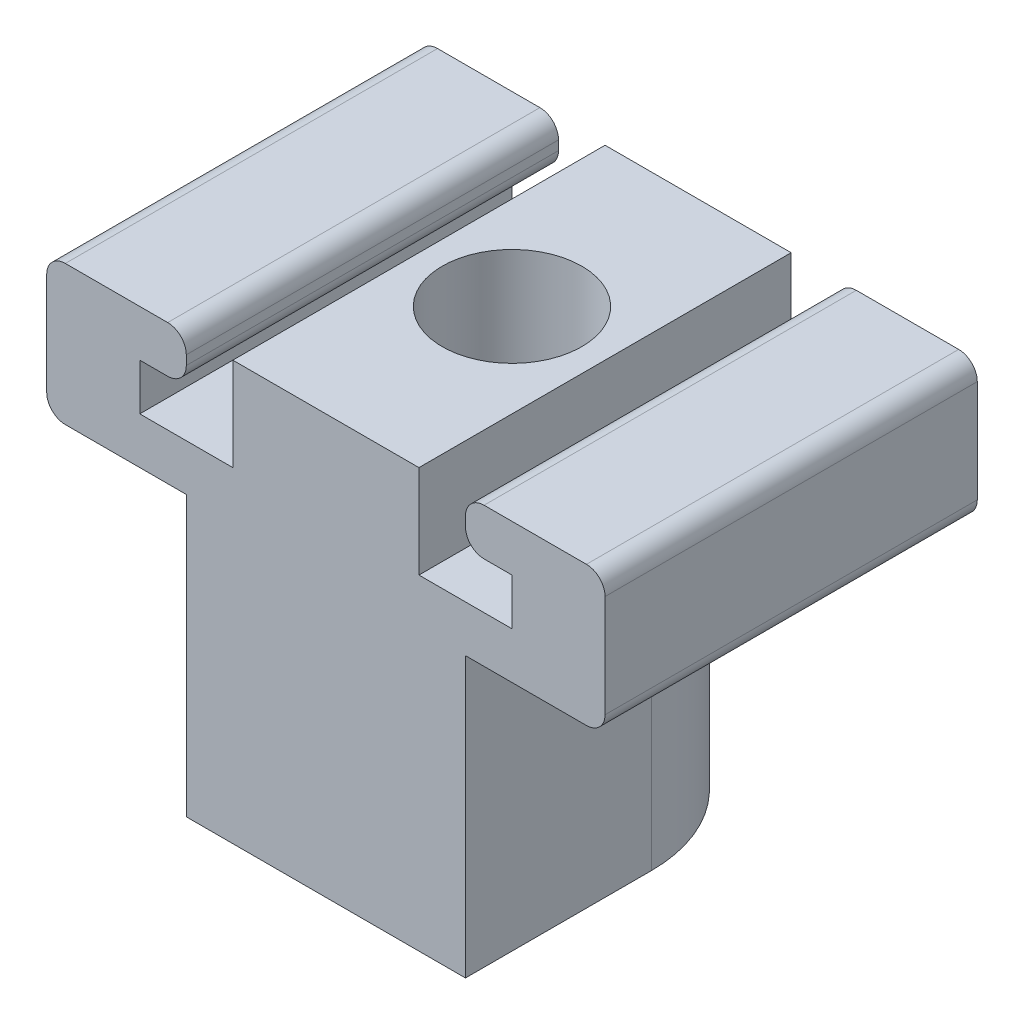
ISO-10303-21;
HEADER;
FILE_DESCRIPTION(('STEP AP214'),'2;1');
FILE_NAME('part.step','',(''),(''),'','','');
FILE_SCHEMA(('AUTOMOTIVE_DESIGN { 1 0 10303 214 1 1 1 1 }'));
ENDSEC;
DATA;
#1=APPLICATION_CONTEXT('core data for automotive mechanical design processes');
#2=APPLICATION_PROTOCOL_DEFINITION('international standard','automotive_design',2000,#1);
#3=PRODUCT_CONTEXT('',#1,'mechanical');
#4=PRODUCT('Part','Part','',(#3));
#5=PRODUCT_RELATED_PRODUCT_CATEGORY('part','',(#4));
#6=PRODUCT_DEFINITION_FORMATION('','',#4);
#7=PRODUCT_DEFINITION_CONTEXT('part definition',#1,'design');
#8=PRODUCT_DEFINITION('design','',#6,#7);
#9=PRODUCT_DEFINITION_SHAPE('','',#8);
#10=(LENGTH_UNIT() NAMED_UNIT(*) SI_UNIT(.MILLI.,.METRE.));
#11=(NAMED_UNIT(*) PLANE_ANGLE_UNIT() SI_UNIT($,.RADIAN.));
#12=(NAMED_UNIT(*) SI_UNIT($,.STERADIAN.) SOLID_ANGLE_UNIT());
#13=UNCERTAINTY_MEASURE_WITH_UNIT(LENGTH_MEASURE(1.E-05),#10,'distance_accuracy_value','');
#14=(GEOMETRIC_REPRESENTATION_CONTEXT(3) GLOBAL_UNCERTAINTY_ASSIGNED_CONTEXT((#13)) GLOBAL_UNIT_ASSIGNED_CONTEXT((#10,
#11,#12)) REPRESENTATION_CONTEXT('',''));
#15=CARTESIAN_POINT('',(0.,0.,0.));
#16=DIRECTION('',(0.,0.,1.));
#17=DIRECTION('',(1.,0.,0.));
#18=AXIS2_PLACEMENT_3D('',#15,#16,#17);
#19=CARTESIAN_POINT('',(0.,9.526,0.));
#20=DIRECTION('',(0.,-1.,0.));
#21=DIRECTION('',(0.,0.,-1.));
#22=AXIS2_PLACEMENT_3D('',#19,#20,#21);
#23=CYLINDRICAL_SURFACE('',#22,4.7625);
#24=CARTESIAN_POINT('',(0.,9.525,0.));
#25=DIRECTION('',(0.,-1.,0.));
#26=DIRECTION('',(0.,0.,-1.));
#27=AXIS2_PLACEMENT_3D('',#24,#25,#26);
#28=CIRCLE('',#27,4.7625);
#29=CARTESIAN_POINT('',(0.,9.525,-4.7625));
#30=VERTEX_POINT('',#29);
#31=EDGE_CURVE('E618',#30,#30,#28,.F.);
#32=ORIENTED_EDGE('',*,*,#31,.T.);
#33=EDGE_LOOP('',(#32));
#34=FACE_BOUND('',#33,.T.);
#35=CARTESIAN_POINT('',(0.,0.,0.));
#36=DIRECTION('',(0.,-1.,0.));
#37=DIRECTION('',(0.,0.,-1.));
#38=AXIS2_PLACEMENT_3D('',#35,#36,#37);
#39=CIRCLE('',#38,4.7625);
#40=CARTESIAN_POINT('',(0.,0.,-4.7625));
#41=VERTEX_POINT('',#40);
#42=EDGE_CURVE('E616',#41,#41,#39,.F.);
#43=ORIENTED_EDGE('',*,*,#42,.F.);
#44=EDGE_LOOP('',(#43));
#45=FACE_BOUND('',#44,.T.);
#46=ADVANCED_FACE('F33',(#34,#45),#23,.F.);
#47=CARTESIAN_POINT('',(0.,9.525,0.));
#48=DIRECTION('',(0.,-1.,0.));
#49=DIRECTION('',(0.,0.,-1.));
#50=AXIS2_PLACEMENT_3D('',#47,#48,#49);
#51=PLANE('',#50);
#52=DIRECTION('',(-1.,0.,0.));
#53=VECTOR('',#52,1.);
#54=CARTESIAN_POINT('',(-19.05,9.525,-12.7));
#55=LINE('',#54,#53);
#56=CARTESIAN_POINT('',(-10.795,9.525,-12.7));
#57=VERTEX_POINT('',#56);
#58=CARTESIAN_POINT('',(-17.78,9.525,-12.7));
#59=VERTEX_POINT('',#58);
#60=EDGE_CURVE('E326',#57,#59,#55,.T.);
#61=ORIENTED_EDGE('',*,*,#60,.T.);
#62=DIRECTION('',(0.,0.,1.));
#63=VECTOR('',#62,1.);
#64=CARTESIAN_POINT('',(-17.78,9.525,0.));
#65=LINE('',#64,#63);
#66=CARTESIAN_POINT('',(-17.78,9.525,12.7));
#67=VERTEX_POINT('',#66);
#68=EDGE_CURVE('E380',#59,#67,#65,.T.);
#69=ORIENTED_EDGE('',*,*,#68,.T.);
#70=DIRECTION('',(1.,0.,0.));
#71=VECTOR('',#70,1.);
#72=CARTESIAN_POINT('',(-19.05,9.525,12.7));
#73=LINE('',#72,#71);
#74=CARTESIAN_POINT('',(-10.795,9.525,12.7));
#75=VERTEX_POINT('',#74);
#76=EDGE_CURVE('E336',#67,#75,#73,.T.);
#77=ORIENTED_EDGE('',*,*,#76,.T.);
#78=DIRECTION('',(0.,0.,-1.));
#79=VECTOR('',#78,1.);
#80=CARTESIAN_POINT('',(-10.795,9.525,-12.7));
#81=LINE('',#80,#79);
#82=EDGE_CURVE('E377',#75,#57,#81,.T.);
#83=ORIENTED_EDGE('',*,*,#82,.T.);
#84=EDGE_LOOP('',(#61,#69,#77,#83));
#85=FACE_BOUND('',#84,.T.);
#86=ADVANCED_FACE('F509',(#85),#51,.F.);
#87=ORIENTED_EDGE('',*,*,#31,.F.);
#88=EDGE_LOOP('',(#87));
#89=FACE_BOUND('',#88,.T.);
#90=DIRECTION('',(0.,0.,-1.));
#91=VECTOR('',#90,1.);
#92=CARTESIAN_POINT('',(-6.35000000000002,9.525,12.701));
#93=LINE('',#92,#91);
#94=CARTESIAN_POINT('',(-6.35000000000002,9.525,12.7));
#95=VERTEX_POINT('',#94);
#96=CARTESIAN_POINT('',(-6.35000000000002,9.525,-12.7));
#97=VERTEX_POINT('',#96);
#98=EDGE_CURVE('E276',#95,#97,#93,.T.);
#99=ORIENTED_EDGE('',*,*,#98,.F.);
#100=CARTESIAN_POINT('',(6.35000000000002,9.525,12.7));
#101=VERTEX_POINT('',#100);
#102=EDGE_CURVE('E335',#95,#101,#73,.T.);
#103=ORIENTED_EDGE('',*,*,#102,.T.);
#104=DIRECTION('',(0.,0.,-1.));
#105=VECTOR('',#104,1.);
#106=CARTESIAN_POINT('',(6.35000000000002,9.525,12.701));
#107=LINE('',#106,#105);
#108=CARTESIAN_POINT('',(6.35000000000002,9.525,-12.7));
#109=VERTEX_POINT('',#108);
#110=EDGE_CURVE('E313',#101,#109,#107,.T.);
#111=ORIENTED_EDGE('',*,*,#110,.T.);
#112=EDGE_CURVE('E329',#109,#97,#55,.T.);
#113=ORIENTED_EDGE('',*,*,#112,.T.);
#114=EDGE_LOOP('',(#99,#103,#111,#113));
#115=FACE_BOUND('',#114,.T.);
#116=ADVANCED_FACE('F463',(#89,#115),#51,.F.);
#117=CARTESIAN_POINT('',(-19.05,9.525,-12.7));
#118=DIRECTION('',(0.,0.,1.));
#119=DIRECTION('',(1.,0.,0.));
#120=AXIS2_PLACEMENT_3D('',#117,#118,#119);
#121=PLANE('',#120);
#122=DIRECTION('',(0.,-1.,0.));
#123=VECTOR('',#122,1.);
#124=CARTESIAN_POINT('',(19.05,9.525,-12.7));
#125=LINE('',#124,#123);
#126=CARTESIAN_POINT('',(19.05,8.255,-12.7));
#127=VERTEX_POINT('',#126);
#128=CARTESIAN_POINT('',(19.05,1.27,-12.7));
#129=VERTEX_POINT('',#128);
#130=EDGE_CURVE('E435',#127,#129,#125,.T.);
#131=ORIENTED_EDGE('',*,*,#130,.T.);
#132=CARTESIAN_POINT('',(17.78,1.27,-12.7));
#133=DIRECTION('',(0.,0.,1.));
#134=DIRECTION('',(1.,0.,0.));
#135=AXIS2_PLACEMENT_3D('',#132,#133,#134);
#136=CIRCLE('',#135,1.27);
#137=CARTESIAN_POINT('',(17.78,0.,-12.7));
#138=VERTEX_POINT('',#137);
#139=EDGE_CURVE('E351',#129,#138,#136,.F.);
#140=ORIENTED_EDGE('',*,*,#139,.T.);
#141=DIRECTION('',(-1.,0.,0.));
#142=VECTOR('',#141,1.);
#143=CARTESIAN_POINT('',(-19.05,0.,-12.7));
#144=LINE('',#143,#142);
#145=CARTESIAN_POINT('',(-17.78,0.,-12.7));
#146=VERTEX_POINT('',#145);
#147=EDGE_CURVE('E325',#138,#146,#144,.T.);
#148=ORIENTED_EDGE('',*,*,#147,.T.);
#149=CARTESIAN_POINT('',(-17.78,1.27,-12.7));
#150=DIRECTION('',(0.,0.,1.));
#151=DIRECTION('',(1.,0.,0.));
#152=AXIS2_PLACEMENT_3D('',#149,#150,#151);
#153=CIRCLE('',#152,1.27);
#154=CARTESIAN_POINT('',(-19.05,1.27,-12.7));
#155=VERTEX_POINT('',#154);
#156=EDGE_CURVE('E429',#146,#155,#153,.F.);
#157=ORIENTED_EDGE('',*,*,#156,.T.);
#158=DIRECTION('',(0.,-1.,0.));
#159=VECTOR('',#158,1.);
#160=CARTESIAN_POINT('',(-19.05,9.525,-12.7));
#161=LINE('',#160,#159);
#162=CARTESIAN_POINT('',(-19.05,8.255,-12.7));
#163=VERTEX_POINT('',#162);
#164=EDGE_CURVE('E455',#163,#155,#161,.T.);
#165=ORIENTED_EDGE('',*,*,#164,.F.);
#166=CARTESIAN_POINT('',(-17.78,8.255,-12.7));
#167=DIRECTION('',(0.,0.,1.));
#168=DIRECTION('',(1.,0.,0.));
#169=AXIS2_PLACEMENT_3D('',#166,#167,#168);
#170=CIRCLE('',#169,1.27);
#171=EDGE_CURVE('E428',#163,#59,#170,.F.);
#172=ORIENTED_EDGE('',*,*,#171,.T.);
#173=ORIENTED_EDGE('',*,*,#60,.F.);
#174=CARTESIAN_POINT('',(-10.795,8.255,-12.7));
#175=DIRECTION('',(0.,0.,1.));
#176=DIRECTION('',(1.,0.,0.));
#177=AXIS2_PLACEMENT_3D('',#174,#175,#176);
#178=CIRCLE('',#177,1.27);
#179=CARTESIAN_POINT('',(-9.52500000000002,8.255,-12.7));
#180=VERTEX_POINT('',#179);
#181=EDGE_CURVE('E411',#57,#180,#178,.F.);
#182=ORIENTED_EDGE('',*,*,#181,.T.);
#183=DIRECTION('',(0.,-1.,0.));
#184=VECTOR('',#183,1.);
#185=CARTESIAN_POINT('',(-9.52500000000002,9.525,-12.7));
#186=LINE('',#185,#184);
#187=CARTESIAN_POINT('',(-9.52500000000002,7.62,-12.7));
#188=VERTEX_POINT('',#187);
#189=EDGE_CURVE('E273',#180,#188,#186,.T.);
#190=ORIENTED_EDGE('',*,*,#189,.T.);
#191=CARTESIAN_POINT('',(-10.795,7.62,-12.7));
#192=DIRECTION('',(0.,0.,1.));
#193=DIRECTION('',(1.,0.,0.));
#194=AXIS2_PLACEMENT_3D('',#191,#192,#193);
#195=CIRCLE('',#194,1.27);
#196=CARTESIAN_POINT('',(-10.795,6.35,-12.7));
#197=VERTEX_POINT('',#196);
#198=EDGE_CURVE('E409',#188,#197,#195,.F.);
#199=ORIENTED_EDGE('',*,*,#198,.T.);
#200=DIRECTION('',(-1.,0.,0.));
#201=VECTOR('',#200,1.);
#202=CARTESIAN_POINT('',(-9.52500000000002,6.35,-12.7));
#203=LINE('',#202,#201);
#204=CARTESIAN_POINT('',(-12.7,6.35,-12.7));
#205=VERTEX_POINT('',#204);
#206=EDGE_CURVE('E271',#197,#205,#203,.T.);
#207=ORIENTED_EDGE('',*,*,#206,.T.);
#208=DIRECTION('',(0.,-1.,0.));
#209=VECTOR('',#208,1.);
#210=CARTESIAN_POINT('',(-12.7,6.35,-12.7));
#211=LINE('',#210,#209);
#212=CARTESIAN_POINT('',(-12.7,3.175,-12.7));
#213=VERTEX_POINT('',#212);
#214=EDGE_CURVE('E268',#205,#213,#211,.T.);
#215=ORIENTED_EDGE('',*,*,#214,.T.);
#216=DIRECTION('',(1.,0.,0.));
#217=VECTOR('',#216,1.);
#218=CARTESIAN_POINT('',(-12.7,3.175,-12.7));
#219=LINE('',#218,#217);
#220=CARTESIAN_POINT('',(-6.35000000000002,3.175,-12.7));
#221=VERTEX_POINT('',#220);
#222=EDGE_CURVE('E265',#213,#221,#219,.T.);
#223=ORIENTED_EDGE('',*,*,#222,.T.);
#224=DIRECTION('',(0.,1.,0.));
#225=VECTOR('',#224,1.);
#226=CARTESIAN_POINT('',(-6.35000000000002,9.525,-12.7));
#227=LINE('',#226,#225);
#228=EDGE_CURVE('E262',#221,#97,#227,.T.);
#229=ORIENTED_EDGE('',*,*,#228,.T.);
#230=ORIENTED_EDGE('',*,*,#112,.F.);
#231=DIRECTION('',(0.,1.,0.));
#232=VECTOR('',#231,1.);
#233=CARTESIAN_POINT('',(6.35000000000002,9.525,-12.7));
#234=LINE('',#233,#232);
#235=CARTESIAN_POINT('',(6.35000000000002,3.175,-12.7));
#236=VERTEX_POINT('',#235);
#237=EDGE_CURVE('E310',#236,#109,#234,.T.);
#238=ORIENTED_EDGE('',*,*,#237,.F.);
#239=DIRECTION('',(-1.,0.,0.));
#240=VECTOR('',#239,1.);
#241=CARTESIAN_POINT('',(12.7,3.175,-12.7));
#242=LINE('',#241,#240);
#243=CARTESIAN_POINT('',(12.7,3.175,-12.7));
#244=VERTEX_POINT('',#243);
#245=EDGE_CURVE('E307',#244,#236,#242,.T.);
#246=ORIENTED_EDGE('',*,*,#245,.F.);
#247=DIRECTION('',(0.,-1.,0.));
#248=VECTOR('',#247,1.);
#249=CARTESIAN_POINT('',(12.7,6.35,-12.7));
#250=LINE('',#249,#248);
#251=CARTESIAN_POINT('',(12.7,6.35,-12.7));
#252=VERTEX_POINT('',#251);
#253=EDGE_CURVE('E304',#252,#244,#250,.T.);
#254=ORIENTED_EDGE('',*,*,#253,.F.);
#255=DIRECTION('',(1.,0.,0.));
#256=VECTOR('',#255,1.);
#257=CARTESIAN_POINT('',(9.52500000000002,6.35,-12.7));
#258=LINE('',#257,#256);
#259=CARTESIAN_POINT('',(10.795,6.35,-12.7));
#260=VERTEX_POINT('',#259);
#261=EDGE_CURVE('E302',#260,#252,#258,.T.);
#262=ORIENTED_EDGE('',*,*,#261,.F.);
#263=CARTESIAN_POINT('',(10.795,7.62,-12.7));
#264=DIRECTION('',(0.,0.,1.));
#265=DIRECTION('',(1.,0.,0.));
#266=AXIS2_PLACEMENT_3D('',#263,#264,#265);
#267=CIRCLE('',#266,1.27);
#268=CARTESIAN_POINT('',(9.52500000000002,7.62,-12.7));
#269=VERTEX_POINT('',#268);
#270=EDGE_CURVE('E424',#260,#269,#267,.F.);
#271=ORIENTED_EDGE('',*,*,#270,.T.);
#272=DIRECTION('',(0.,-1.,0.));
#273=VECTOR('',#272,1.);
#274=CARTESIAN_POINT('',(9.52500000000002,9.525,-12.7));
#275=LINE('',#274,#273);
#276=CARTESIAN_POINT('',(9.52500000000002,8.255,-12.7));
#277=VERTEX_POINT('',#276);
#278=EDGE_CURVE('E299',#277,#269,#275,.T.);
#279=ORIENTED_EDGE('',*,*,#278,.F.);
#280=CARTESIAN_POINT('',(10.795,8.255,-12.7));
#281=DIRECTION('',(0.,0.,1.));
#282=DIRECTION('',(1.,0.,0.));
#283=AXIS2_PLACEMENT_3D('',#280,#281,#282);
#284=CIRCLE('',#283,1.27);
#285=CARTESIAN_POINT('',(10.795,9.525,-12.7));
#286=VERTEX_POINT('',#285);
#287=EDGE_CURVE('E416',#277,#286,#284,.F.);
#288=ORIENTED_EDGE('',*,*,#287,.T.);
#289=CARTESIAN_POINT('',(17.78,9.525,-12.7));
#290=VERTEX_POINT('',#289);
#291=EDGE_CURVE('E331',#290,#286,#55,.T.);
#292=ORIENTED_EDGE('',*,*,#291,.F.);
#293=CARTESIAN_POINT('',(17.78,8.255,-12.7));
#294=DIRECTION('',(0.,0.,1.));
#295=DIRECTION('',(1.,0.,0.));
#296=AXIS2_PLACEMENT_3D('',#293,#294,#295);
#297=CIRCLE('',#296,1.27);
#298=EDGE_CURVE('E426',#290,#127,#297,.F.);
#299=ORIENTED_EDGE('',*,*,#298,.T.);
#300=EDGE_LOOP('',(#131,#140,#148,#157,#165,#172,#173,#182,#190,#199,#207,#215,#223,#229,#230,
#238,#246,#254,#262,#271,#279,#288,#292,#299));
#301=FACE_BOUND('',#300,.T.);
#302=ADVANCED_FACE('F408',(#301),#121,.F.);
#303=CARTESIAN_POINT('',(-19.05,9.525,12.7));
#304=DIRECTION('',(0.,0.,-1.));
#305=DIRECTION('',(-1.,0.,0.));
#306=AXIS2_PLACEMENT_3D('',#303,#304,#305);
#307=PLANE('',#306);
#308=DIRECTION('',(1.,0.,0.));
#309=VECTOR('',#308,1.);
#310=CARTESIAN_POINT('',(-19.05,0.,12.7));
#311=LINE('',#310,#309);
#312=CARTESIAN_POINT('',(9.525,0.,12.7));
#313=VERTEX_POINT('',#312);
#314=CARTESIAN_POINT('',(17.78,0.,12.7));
#315=VERTEX_POINT('',#314);
#316=EDGE_CURVE('E339',#313,#315,#311,.T.);
#317=ORIENTED_EDGE('',*,*,#316,.T.);
#318=CARTESIAN_POINT('',(17.78,1.27,12.7));
#319=DIRECTION('',(0.,0.,-1.));
#320=DIRECTION('',(-1.,0.,0.));
#321=AXIS2_PLACEMENT_3D('',#318,#319,#320);
#322=CIRCLE('',#321,1.27);
#323=CARTESIAN_POINT('',(19.05,1.27,12.7));
#324=VERTEX_POINT('',#323);
#325=EDGE_CURVE('E370',#315,#324,#322,.F.);
#326=ORIENTED_EDGE('',*,*,#325,.T.);
#327=DIRECTION('',(0.,-1.,0.));
#328=VECTOR('',#327,1.);
#329=CARTESIAN_POINT('',(19.05,9.525,12.7));
#330=LINE('',#329,#328);
#331=CARTESIAN_POINT('',(19.05,8.255,12.7));
#332=VERTEX_POINT('',#331);
#333=EDGE_CURVE('E342',#332,#324,#330,.T.);
#334=ORIENTED_EDGE('',*,*,#333,.F.);
#335=CARTESIAN_POINT('',(17.78,8.255,12.7));
#336=DIRECTION('',(0.,0.,-1.));
#337=DIRECTION('',(-1.,0.,0.));
#338=AXIS2_PLACEMENT_3D('',#335,#336,#337);
#339=CIRCLE('',#338,1.27);
#340=CARTESIAN_POINT('',(17.78,9.525,12.7));
#341=VERTEX_POINT('',#340);
#342=EDGE_CURVE('E364',#332,#341,#339,.F.);
#343=ORIENTED_EDGE('',*,*,#342,.T.);
#344=CARTESIAN_POINT('',(10.795,9.525,12.7));
#345=VERTEX_POINT('',#344);
#346=EDGE_CURVE('E332',#345,#341,#73,.T.);
#347=ORIENTED_EDGE('',*,*,#346,.F.);
#348=CARTESIAN_POINT('',(10.795,8.255,12.7));
#349=DIRECTION('',(0.,0.,-1.));
#350=DIRECTION('',(-1.,0.,0.));
#351=AXIS2_PLACEMENT_3D('',#348,#349,#350);
#352=CIRCLE('',#351,1.27);
#353=CARTESIAN_POINT('',(9.52500000000002,8.255,12.7));
#354=VERTEX_POINT('',#353);
#355=EDGE_CURVE('E361',#345,#354,#352,.F.);
#356=ORIENTED_EDGE('',*,*,#355,.T.);
#357=DIRECTION('',(0.,1.,0.));
#358=VECTOR('',#357,1.);
#359=CARTESIAN_POINT('',(9.52500000000002,9.525,12.7));
#360=LINE('',#359,#358);
#361=CARTESIAN_POINT('',(9.52500000000002,7.62,12.7));
#362=VERTEX_POINT('',#361);
#363=EDGE_CURVE('E316',#362,#354,#360,.T.);
#364=ORIENTED_EDGE('',*,*,#363,.F.);
#365=CARTESIAN_POINT('',(10.795,7.62,12.7));
#366=DIRECTION('',(0.,0.,-1.));
#367=DIRECTION('',(-1.,0.,0.));
#368=AXIS2_PLACEMENT_3D('',#365,#366,#367);
#369=CIRCLE('',#368,1.27);
#370=CARTESIAN_POINT('',(10.795,6.35,12.7));
#371=VERTEX_POINT('',#370);
#372=EDGE_CURVE('E54',#362,#371,#369,.F.);
#373=ORIENTED_EDGE('',*,*,#372,.T.);
#374=DIRECTION('',(-1.,0.,0.));
#375=VECTOR('',#374,1.);
#376=CARTESIAN_POINT('',(9.52500000000002,6.35,12.7));
#377=LINE('',#376,#375);
#378=CARTESIAN_POINT('',(12.7,6.35,12.7));
#379=VERTEX_POINT('',#378);
#380=EDGE_CURVE('E288',#379,#371,#377,.T.);
#381=ORIENTED_EDGE('',*,*,#380,.F.);
#382=DIRECTION('',(0.,1.,0.));
#383=VECTOR('',#382,1.);
#384=CARTESIAN_POINT('',(12.7,6.35,12.7));
#385=LINE('',#384,#383);
#386=CARTESIAN_POINT('',(12.7,3.175,12.7));
#387=VERTEX_POINT('',#386);
#388=EDGE_CURVE('E290',#387,#379,#385,.T.);
#389=ORIENTED_EDGE('',*,*,#388,.F.);
#390=DIRECTION('',(1.,0.,0.));
#391=VECTOR('',#390,1.);
#392=CARTESIAN_POINT('',(12.7,3.175,12.7));
#393=LINE('',#392,#391);
#394=CARTESIAN_POINT('',(6.35000000000002,3.175,12.7));
#395=VERTEX_POINT('',#394);
#396=EDGE_CURVE('E293',#395,#387,#393,.T.);
#397=ORIENTED_EDGE('',*,*,#396,.F.);
#398=DIRECTION('',(0.,-1.,0.));
#399=VECTOR('',#398,1.);
#400=CARTESIAN_POINT('',(6.35000000000002,9.525,12.7));
#401=LINE('',#400,#399);
#402=EDGE_CURVE('E296',#101,#395,#401,.T.);
#403=ORIENTED_EDGE('',*,*,#402,.F.);
#404=ORIENTED_EDGE('',*,*,#102,.F.);
#405=DIRECTION('',(0.,-1.,0.));
#406=VECTOR('',#405,1.);
#407=CARTESIAN_POINT('',(-6.35000000000002,9.525,12.7));
#408=LINE('',#407,#406);
#409=CARTESIAN_POINT('',(-6.35000000000002,3.175,12.7));
#410=VERTEX_POINT('',#409);
#411=EDGE_CURVE('E280',#95,#410,#408,.T.);
#412=ORIENTED_EDGE('',*,*,#411,.T.);
#413=DIRECTION('',(-1.,0.,0.));
#414=VECTOR('',#413,1.);
#415=CARTESIAN_POINT('',(-12.7,3.175,12.7));
#416=LINE('',#415,#414);
#417=CARTESIAN_POINT('',(-12.7,3.175,12.7));
#418=VERTEX_POINT('',#417);
#419=EDGE_CURVE('E244',#410,#418,#416,.T.);
#420=ORIENTED_EDGE('',*,*,#419,.T.);
#421=DIRECTION('',(0.,1.,0.));
#422=VECTOR('',#421,1.);
#423=CARTESIAN_POINT('',(-12.7,6.35,12.7));
#424=LINE('',#423,#422);
#425=CARTESIAN_POINT('',(-12.7,6.35,12.7));
#426=VERTEX_POINT('',#425);
#427=EDGE_CURVE('E247',#418,#426,#424,.T.);
#428=ORIENTED_EDGE('',*,*,#427,.T.);
#429=DIRECTION('',(1.,0.,0.));
#430=VECTOR('',#429,1.);
#431=CARTESIAN_POINT('',(-9.52500000000002,6.35,12.7));
#432=LINE('',#431,#430);
#433=CARTESIAN_POINT('',(-10.795,6.35,12.7));
#434=VERTEX_POINT('',#433);
#435=EDGE_CURVE('E257',#426,#434,#432,.T.);
#436=ORIENTED_EDGE('',*,*,#435,.T.);
#437=CARTESIAN_POINT('',(-10.795,7.62,12.7));
#438=DIRECTION('',(0.,0.,-1.));
#439=DIRECTION('',(-1.,0.,0.));
#440=AXIS2_PLACEMENT_3D('',#437,#438,#439);
#441=CIRCLE('',#440,1.27);
#442=CARTESIAN_POINT('',(-9.52500000000002,7.62,12.7));
#443=VERTEX_POINT('',#442);
#444=EDGE_CURVE('E359',#434,#443,#441,.F.);
#445=ORIENTED_EDGE('',*,*,#444,.T.);
#446=DIRECTION('',(0.,1.,0.));
#447=VECTOR('',#446,1.);
#448=CARTESIAN_POINT('',(-9.52500000000002,9.525,12.7));
#449=LINE('',#448,#447);
#450=CARTESIAN_POINT('',(-9.52500000000002,8.255,12.7));
#451=VERTEX_POINT('',#450);
#452=EDGE_CURVE('E259',#443,#451,#449,.T.);
#453=ORIENTED_EDGE('',*,*,#452,.T.);
#454=CARTESIAN_POINT('',(-10.795,8.255,12.7));
#455=DIRECTION('',(0.,0.,-1.));
#456=DIRECTION('',(-1.,0.,0.));
#457=AXIS2_PLACEMENT_3D('',#454,#455,#456);
#458=CIRCLE('',#457,1.27);
#459=EDGE_CURVE('E357',#451,#75,#458,.F.);
#460=ORIENTED_EDGE('',*,*,#459,.T.);
#461=ORIENTED_EDGE('',*,*,#76,.F.);
#462=CARTESIAN_POINT('',(-17.78,8.255,12.7));
#463=DIRECTION('',(0.,0.,-1.));
#464=DIRECTION('',(-1.,0.,0.));
#465=AXIS2_PLACEMENT_3D('',#462,#463,#464);
#466=CIRCLE('',#465,1.27);
#467=CARTESIAN_POINT('',(-19.05,8.255,12.7));
#468=VERTEX_POINT('',#467);
#469=EDGE_CURVE('E366',#67,#468,#466,.F.);
#470=ORIENTED_EDGE('',*,*,#469,.T.);
#471=DIRECTION('',(0.,-1.,0.));
#472=VECTOR('',#471,1.);
#473=CARTESIAN_POINT('',(-19.05,9.525,12.7));
#474=LINE('',#473,#472);
#475=CARTESIAN_POINT('',(-19.05,1.27,12.7));
#476=VERTEX_POINT('',#475);
#477=EDGE_CURVE('E453',#468,#476,#474,.T.);
#478=ORIENTED_EDGE('',*,*,#477,.T.);
#479=CARTESIAN_POINT('',(-17.78,1.27,12.7));
#480=DIRECTION('',(0.,0.,-1.));
#481=DIRECTION('',(-1.,0.,0.));
#482=AXIS2_PLACEMENT_3D('',#479,#480,#481);
#483=CIRCLE('',#482,1.27);
#484=CARTESIAN_POINT('',(-17.78,0.,12.7));
#485=VERTEX_POINT('',#484);
#486=EDGE_CURVE('E368',#476,#485,#483,.F.);
#487=ORIENTED_EDGE('',*,*,#486,.T.);
#488=CARTESIAN_POINT('',(-9.525,0.,12.7));
#489=VERTEX_POINT('',#488);
#490=EDGE_CURVE('E330',#485,#489,#311,.T.);
#491=ORIENTED_EDGE('',*,*,#490,.T.);
#492=DIRECTION('',(0.,1.,0.));
#493=VECTOR('',#492,1.);
#494=CARTESIAN_POINT('',(-9.525,-19.05,12.7));
#495=LINE('',#494,#493);
#496=CARTESIAN_POINT('',(-9.525,-19.05,12.7));
#497=VERTEX_POINT('',#496);
#498=EDGE_CURVE('E249',#497,#489,#495,.T.);
#499=ORIENTED_EDGE('',*,*,#498,.F.);
#500=DIRECTION('',(-1.,0.,0.));
#501=VECTOR('',#500,1.);
#502=CARTESIAN_POINT('',(-9.525,-19.05,12.7));
#503=LINE('',#502,#501);
#504=CARTESIAN_POINT('',(9.525,-19.05,12.7));
#505=VERTEX_POINT('',#504);
#506=EDGE_CURVE('E230',#505,#497,#503,.T.);
#507=ORIENTED_EDGE('',*,*,#506,.F.);
#508=DIRECTION('',(0.,1.,0.));
#509=VECTOR('',#508,1.);
#510=CARTESIAN_POINT('',(9.525,-19.05,12.7));
#511=LINE('',#510,#509);
#512=EDGE_CURVE('E227',#505,#313,#511,.T.);
#513=ORIENTED_EDGE('',*,*,#512,.T.);
#514=EDGE_LOOP('',(#317,#326,#334,#343,#347,#356,#364,#373,#381,#389,#397,#403,#404,#412,#420,
#428,#436,#445,#453,#460,#461,#470,#478,#487,#491,#499,#507,#513));
#515=FACE_BOUND('',#514,.T.);
#516=ADVANCED_FACE('F448',(#515),#307,.F.);
#517=CARTESIAN_POINT('',(19.05,9.525,12.7));
#518=DIRECTION('',(-1.,0.,0.));
#519=DIRECTION('',(0.,0.,1.));
#520=AXIS2_PLACEMENT_3D('',#517,#518,#519);
#521=PLANE('',#520);
#522=ORIENTED_EDGE('',*,*,#333,.T.);
#523=DIRECTION('',(0.,0.,-1.));
#524=VECTOR('',#523,1.);
#525=CARTESIAN_POINT('',(19.05,1.27,-12.7));
#526=LINE('',#525,#524);
#527=EDGE_CURVE('E414',#324,#129,#526,.T.);
#528=ORIENTED_EDGE('',*,*,#527,.T.);
#529=ORIENTED_EDGE('',*,*,#130,.F.);
#530=DIRECTION('',(0.,0.,-1.));
#531=VECTOR('',#530,1.);
#532=CARTESIAN_POINT('',(19.05,8.255,12.7));
#533=LINE('',#532,#531);
#534=EDGE_CURVE('E419',#127,#332,#533,.F.);
#535=ORIENTED_EDGE('',*,*,#534,.T.);
#536=EDGE_LOOP('',(#522,#528,#529,#535));
#537=FACE_BOUND('',#536,.T.);
#538=ADVANCED_FACE('F451',(#537),#521,.F.);
#539=CARTESIAN_POINT('',(-19.05,9.525,12.7));
#540=DIRECTION('',(1.,0.,0.));
#541=DIRECTION('',(0.,0.,-1.));
#542=AXIS2_PLACEMENT_3D('',#539,#540,#541);
#543=PLANE('',#542);
#544=ORIENTED_EDGE('',*,*,#164,.T.);
#545=DIRECTION('',(0.,0.,1.));
#546=VECTOR('',#545,1.);
#547=CARTESIAN_POINT('',(-19.05,1.27,12.7));
#548=LINE('',#547,#546);
#549=EDGE_CURVE('E374',#155,#476,#548,.T.);
#550=ORIENTED_EDGE('',*,*,#549,.T.);
#551=ORIENTED_EDGE('',*,*,#477,.F.);
#552=DIRECTION('',(0.,0.,1.));
#553=VECTOR('',#552,1.);
#554=CARTESIAN_POINT('',(-19.05,8.255,12.7));
#555=LINE('',#554,#553);
#556=EDGE_CURVE('E372',#468,#163,#555,.F.);
#557=ORIENTED_EDGE('',*,*,#556,.T.);
#558=EDGE_LOOP('',(#544,#550,#551,#557));
#559=FACE_BOUND('',#558,.T.);
#560=ADVANCED_FACE('F559',(#559),#543,.F.);
#561=ORIENTED_EDGE('',*,*,#346,.T.);
#562=DIRECTION('',(0.,0.,-1.));
#563=VECTOR('',#562,1.);
#564=CARTESIAN_POINT('',(17.78,9.525,0.));
#565=LINE('',#564,#563);
#566=EDGE_CURVE('E385',#341,#290,#565,.T.);
#567=ORIENTED_EDGE('',*,*,#566,.T.);
#568=ORIENTED_EDGE('',*,*,#291,.T.);
#569=DIRECTION('',(0.,0.,-1.));
#570=VECTOR('',#569,1.);
#571=CARTESIAN_POINT('',(10.795,9.525,0.));
#572=LINE('',#571,#570);
#573=EDGE_CURVE('E383',#286,#345,#572,.F.);
#574=ORIENTED_EDGE('',*,*,#573,.T.);
#575=EDGE_LOOP('',(#561,#567,#568,#574));
#576=FACE_BOUND('',#575,.T.);
#577=ADVANCED_FACE('F481',(#576),#51,.F.);
#578=CARTESIAN_POINT('',(0.,0.,0.));
#579=DIRECTION('',(0.,-1.,0.));
#580=DIRECTION('',(0.,0.,-1.));
#581=AXIS2_PLACEMENT_3D('',#578,#579,#580);
#582=PLANE('',#581);
#583=ORIENTED_EDGE('',*,*,#147,.F.);
#584=DIRECTION('',(0.,0.,-1.));
#585=VECTOR('',#584,1.);
#586=CARTESIAN_POINT('',(17.78,0.,12.7));
#587=LINE('',#586,#585);
#588=EDGE_CURVE('E355',#138,#315,#587,.F.);
#589=ORIENTED_EDGE('',*,*,#588,.T.);
#590=ORIENTED_EDGE('',*,*,#316,.F.);
#591=DIRECTION('',(0.,0.,1.));
#592=VECTOR('',#591,1.);
#593=CARTESIAN_POINT('',(9.525,0.,0.));
#594=LINE('',#593,#592);
#595=CARTESIAN_POINT('',(9.525,0.,0.));
#596=VERTEX_POINT('',#595);
#597=EDGE_CURVE('E608',#596,#313,#594,.T.);
#598=ORIENTED_EDGE('',*,*,#597,.F.);
#599=CARTESIAN_POINT('',(0.,0.,0.));
#600=DIRECTION('',(0.,-1.,0.));
#601=DIRECTION('',(0.,0.,1.));
#602=AXIS2_PLACEMENT_3D('',#599,#600,#601);
#603=CIRCLE('',#602,9.525);
#604=CARTESIAN_POINT('',(-9.525,0.,0.));
#605=VERTEX_POINT('',#604);
#606=EDGE_CURVE('E243',#605,#596,#603,.T.);
#607=ORIENTED_EDGE('',*,*,#606,.F.);
#608=DIRECTION('',(0.,0.,-1.));
#609=VECTOR('',#608,1.);
#610=CARTESIAN_POINT('',(-9.525,0.,0.));
#611=LINE('',#610,#609);
#612=EDGE_CURVE('E240',#489,#605,#611,.T.);
#613=ORIENTED_EDGE('',*,*,#612,.F.);
#614=ORIENTED_EDGE('',*,*,#490,.F.);
#615=DIRECTION('',(0.,0.,1.));
#616=VECTOR('',#615,1.);
#617=CARTESIAN_POINT('',(-17.78,0.,-12.7));
#618=LINE('',#617,#616);
#619=EDGE_CURVE('E353',#485,#146,#618,.F.);
#620=ORIENTED_EDGE('',*,*,#619,.T.);
#621=EDGE_LOOP('',(#583,#589,#590,#598,#607,#613,#614,#620));
#622=FACE_BOUND('',#621,.T.);
#623=ADVANCED_FACE('F440',(#622),#582,.T.);
#624=CARTESIAN_POINT('',(6.35000000000002,9.525,12.701));
#625=DIRECTION('',(-1.,0.,0.));
#626=DIRECTION('',(0.,-1.,0.));
#627=AXIS2_PLACEMENT_3D('',#624,#625,#626);
#628=PLANE('',#627);
#629=ORIENTED_EDGE('',*,*,#402,.T.);
#630=DIRECTION('',(0.,0.,-1.));
#631=VECTOR('',#630,1.);
#632=CARTESIAN_POINT('',(6.35000000000002,3.175,12.701));
#633=LINE('',#632,#631);
#634=EDGE_CURVE('E317',#395,#236,#633,.T.);
#635=ORIENTED_EDGE('',*,*,#634,.T.);
#636=ORIENTED_EDGE('',*,*,#237,.T.);
#637=ORIENTED_EDGE('',*,*,#110,.F.);
#638=EDGE_LOOP('',(#629,#635,#636,#637));
#639=FACE_BOUND('',#638,.T.);
#640=ADVANCED_FACE('F468',(#639),#628,.F.);
#641=CARTESIAN_POINT('',(12.7,3.175,12.701));
#642=DIRECTION('',(0.,-1.,0.));
#643=DIRECTION('',(0.,0.,-1.));
#644=AXIS2_PLACEMENT_3D('',#641,#642,#643);
#645=PLANE('',#644);
#646=ORIENTED_EDGE('',*,*,#396,.T.);
#647=DIRECTION('',(0.,0.,-1.));
#648=VECTOR('',#647,1.);
#649=CARTESIAN_POINT('',(12.7,3.175,12.701));
#650=LINE('',#649,#648);
#651=EDGE_CURVE('E319',#387,#244,#650,.T.);
#652=ORIENTED_EDGE('',*,*,#651,.T.);
#653=ORIENTED_EDGE('',*,*,#245,.T.);
#654=ORIENTED_EDGE('',*,*,#634,.F.);
#655=EDGE_LOOP('',(#646,#652,#653,#654));
#656=FACE_BOUND('',#655,.T.);
#657=ADVANCED_FACE('F473',(#656),#645,.F.);
#658=CARTESIAN_POINT('',(12.7,6.35,12.701));
#659=DIRECTION('',(1.,0.,0.));
#660=DIRECTION('',(0.,0.,-1.));
#661=AXIS2_PLACEMENT_3D('',#658,#659,#660);
#662=PLANE('',#661);
#663=ORIENTED_EDGE('',*,*,#388,.T.);
#664=DIRECTION('',(0.,0.,-1.));
#665=VECTOR('',#664,1.);
#666=CARTESIAN_POINT('',(12.7,6.35,12.701));
#667=LINE('',#666,#665);
#668=EDGE_CURVE('E312',#379,#252,#667,.T.);
#669=ORIENTED_EDGE('',*,*,#668,.T.);
#670=ORIENTED_EDGE('',*,*,#253,.T.);
#671=ORIENTED_EDGE('',*,*,#651,.F.);
#672=EDGE_LOOP('',(#663,#669,#670,#671));
#673=FACE_BOUND('',#672,.T.);
#674=ADVANCED_FACE('F499',(#673),#662,.F.);
#675=CARTESIAN_POINT('',(9.52500000000002,6.35,12.701));
#676=DIRECTION('',(0.,1.,0.));
#677=DIRECTION('',(-1.,0.,0.));
#678=AXIS2_PLACEMENT_3D('',#675,#676,#677);
#679=PLANE('',#678);
#680=ORIENTED_EDGE('',*,*,#380,.T.);
#681=DIRECTION('',(0.,0.,-1.));
#682=VECTOR('',#681,1.);
#683=CARTESIAN_POINT('',(10.795,6.35,12.701));
#684=LINE('',#683,#682);
#685=EDGE_CURVE('E388',#371,#260,#684,.T.);
#686=ORIENTED_EDGE('',*,*,#685,.T.);
#687=ORIENTED_EDGE('',*,*,#261,.T.);
#688=ORIENTED_EDGE('',*,*,#668,.F.);
#689=EDGE_LOOP('',(#680,#686,#687,#688));
#690=FACE_BOUND('',#689,.T.);
#691=ADVANCED_FACE('F497',(#690),#679,.F.);
#692=CARTESIAN_POINT('',(9.52500000000002,9.525,12.701));
#693=DIRECTION('',(1.,0.,0.));
#694=DIRECTION('',(0.,0.,-1.));
#695=AXIS2_PLACEMENT_3D('',#692,#693,#694);
#696=PLANE('',#695);
#697=ORIENTED_EDGE('',*,*,#278,.T.);
#698=DIRECTION('',(0.,0.,-1.));
#699=VECTOR('',#698,1.);
#700=CARTESIAN_POINT('',(9.52500000000002,7.62,12.701));
#701=LINE('',#700,#699);
#702=EDGE_CURVE('E394',#269,#362,#701,.F.);
#703=ORIENTED_EDGE('',*,*,#702,.T.);
#704=ORIENTED_EDGE('',*,*,#363,.T.);
#705=DIRECTION('',(0.,0.,-1.));
#706=VECTOR('',#705,1.);
#707=CARTESIAN_POINT('',(9.52500000000002,8.255,12.701));
#708=LINE('',#707,#706);
#709=EDGE_CURVE('E391',#354,#277,#708,.T.);
#710=ORIENTED_EDGE('',*,*,#709,.T.);
#711=EDGE_LOOP('',(#697,#703,#704,#710));
#712=FACE_BOUND('',#711,.T.);
#713=ADVANCED_FACE('F489',(#712),#696,.F.);
#714=CARTESIAN_POINT('',(-9.52500000000002,9.525,12.701));
#715=DIRECTION('',(1.,0.,0.));
#716=DIRECTION('',(0.,0.,-1.));
#717=AXIS2_PLACEMENT_3D('',#714,#715,#716);
#718=PLANE('',#717);
#719=ORIENTED_EDGE('',*,*,#452,.F.);
#720=DIRECTION('',(0.,0.,-1.));
#721=VECTOR('',#720,1.);
#722=CARTESIAN_POINT('',(-9.52500000000002,7.62,12.701));
#723=LINE('',#722,#721);
#724=EDGE_CURVE('E41',#443,#188,#723,.T.);
#725=ORIENTED_EDGE('',*,*,#724,.T.);
#726=ORIENTED_EDGE('',*,*,#189,.F.);
#727=DIRECTION('',(0.,0.,-1.));
#728=VECTOR('',#727,1.);
#729=CARTESIAN_POINT('',(-9.52500000000002,8.255,12.7));
#730=LINE('',#729,#728);
#731=EDGE_CURVE('E396',#180,#451,#730,.F.);
#732=ORIENTED_EDGE('',*,*,#731,.T.);
#733=EDGE_LOOP('',(#719,#725,#726,#732));
#734=FACE_BOUND('',#733,.T.);
#735=ADVANCED_FACE('F402',(#734),#718,.T.);
#736=CARTESIAN_POINT('',(-9.52500000000002,6.35,12.701));
#737=DIRECTION('',(0.,-1.,0.));
#738=DIRECTION('',(1.,0.,0.));
#739=AXIS2_PLACEMENT_3D('',#736,#737,#738);
#740=PLANE('',#739);
#741=ORIENTED_EDGE('',*,*,#206,.F.);
#742=DIRECTION('',(0.,0.,-1.));
#743=VECTOR('',#742,1.);
#744=CARTESIAN_POINT('',(-10.795,6.35,12.701));
#745=LINE('',#744,#743);
#746=EDGE_CURVE('E11',#197,#434,#745,.F.);
#747=ORIENTED_EDGE('',*,*,#746,.T.);
#748=ORIENTED_EDGE('',*,*,#435,.F.);
#749=DIRECTION('',(0.,0.,-1.));
#750=VECTOR('',#749,1.);
#751=CARTESIAN_POINT('',(-12.7,6.35,12.701));
#752=LINE('',#751,#750);
#753=EDGE_CURVE('E277',#426,#205,#752,.T.);
#754=ORIENTED_EDGE('',*,*,#753,.T.);
#755=EDGE_LOOP('',(#741,#747,#748,#754));
#756=FACE_BOUND('',#755,.T.);
#757=ADVANCED_FACE('F537',(#756),#740,.T.);
#758=CARTESIAN_POINT('',(-12.7,6.35,12.701));
#759=DIRECTION('',(1.,0.,0.));
#760=DIRECTION('',(0.,0.,-1.));
#761=AXIS2_PLACEMENT_3D('',#758,#759,#760);
#762=PLANE('',#761);
#763=DIRECTION('',(0.,0.,-1.));
#764=VECTOR('',#763,1.);
#765=CARTESIAN_POINT('',(-12.7,3.175,12.701));
#766=LINE('',#765,#764);
#767=EDGE_CURVE('E281',#418,#213,#766,.T.);
#768=ORIENTED_EDGE('',*,*,#767,.T.);
#769=ORIENTED_EDGE('',*,*,#214,.F.);
#770=ORIENTED_EDGE('',*,*,#753,.F.);
#771=ORIENTED_EDGE('',*,*,#427,.F.);
#772=EDGE_LOOP('',(#768,#769,#770,#771));
#773=FACE_BOUND('',#772,.T.);
#774=ADVANCED_FACE('F540',(#773),#762,.T.);
#775=CARTESIAN_POINT('',(-12.7,3.175,12.701));
#776=DIRECTION('',(0.,1.,0.));
#777=DIRECTION('',(0.,0.,1.));
#778=AXIS2_PLACEMENT_3D('',#775,#776,#777);
#779=PLANE('',#778);
#780=DIRECTION('',(0.,0.,-1.));
#781=VECTOR('',#780,1.);
#782=CARTESIAN_POINT('',(-6.35000000000002,3.175,12.701));
#783=LINE('',#782,#781);
#784=EDGE_CURVE('E283',#410,#221,#783,.T.);
#785=ORIENTED_EDGE('',*,*,#784,.T.);
#786=ORIENTED_EDGE('',*,*,#222,.F.);
#787=ORIENTED_EDGE('',*,*,#767,.F.);
#788=ORIENTED_EDGE('',*,*,#419,.F.);
#789=EDGE_LOOP('',(#785,#786,#787,#788));
#790=FACE_BOUND('',#789,.T.);
#791=ADVANCED_FACE('F543',(#790),#779,.T.);
#792=CARTESIAN_POINT('',(-6.35000000000002,9.525,12.701));
#793=DIRECTION('',(-1.,0.,0.));
#794=DIRECTION('',(0.,-1.,0.));
#795=AXIS2_PLACEMENT_3D('',#792,#793,#794);
#796=PLANE('',#795);
#797=ORIENTED_EDGE('',*,*,#98,.T.);
#798=ORIENTED_EDGE('',*,*,#228,.F.);
#799=ORIENTED_EDGE('',*,*,#784,.F.);
#800=ORIENTED_EDGE('',*,*,#411,.F.);
#801=EDGE_LOOP('',(#797,#798,#799,#800));
#802=FACE_BOUND('',#801,.T.);
#803=ADVANCED_FACE('F534',(#802),#796,.T.);
#804=CARTESIAN_POINT('',(0.,-19.05,0.));
#805=DIRECTION('',(0.,1.,0.));
#806=DIRECTION('',(0.,0.,1.));
#807=AXIS2_PLACEMENT_3D('',#804,#805,#806);
#808=CYLINDRICAL_SURFACE('',#807,9.525);
#809=ORIENTED_EDGE('',*,*,#606,.T.);
#810=DIRECTION('',(0.,1.,0.));
#811=VECTOR('',#810,1.);
#812=CARTESIAN_POINT('',(9.525,-19.05,0.));
#813=LINE('',#812,#811);
#814=CARTESIAN_POINT('',(9.525,-19.05,0.));
#815=VERTEX_POINT('',#814);
#816=EDGE_CURVE('E224',#815,#596,#813,.T.);
#817=ORIENTED_EDGE('',*,*,#816,.F.);
#818=CARTESIAN_POINT('',(0.,-19.05,0.));
#819=DIRECTION('',(0.,-1.,0.));
#820=DIRECTION('',(0.,0.,1.));
#821=AXIS2_PLACEMENT_3D('',#818,#819,#820);
#822=CIRCLE('',#821,9.525);
#823=CARTESIAN_POINT('',(-9.525,-19.05,0.));
#824=VERTEX_POINT('',#823);
#825=EDGE_CURVE('E231',#824,#815,#822,.T.);
#826=ORIENTED_EDGE('',*,*,#825,.F.);
#827=DIRECTION('',(0.,1.,0.));
#828=VECTOR('',#827,1.);
#829=CARTESIAN_POINT('',(-9.525,-19.05,0.));
#830=LINE('',#829,#828);
#831=EDGE_CURVE('E252',#824,#605,#830,.T.);
#832=ORIENTED_EDGE('',*,*,#831,.T.);
#833=EDGE_LOOP('',(#809,#817,#826,#832));
#834=FACE_BOUND('',#833,.T.);
#835=ADVANCED_FACE('F242',(#834),#808,.T.);
#836=CARTESIAN_POINT('',(9.525,-19.05,0.));
#837=DIRECTION('',(-1.,0.,0.));
#838=DIRECTION('',(0.,0.,1.));
#839=AXIS2_PLACEMENT_3D('',#836,#837,#838);
#840=PLANE('',#839);
#841=ORIENTED_EDGE('',*,*,#597,.T.);
#842=ORIENTED_EDGE('',*,*,#512,.F.);
#843=DIRECTION('',(0.,0.,1.));
#844=VECTOR('',#843,1.);
#845=CARTESIAN_POINT('',(9.525,-19.05,0.));
#846=LINE('',#845,#844);
#847=EDGE_CURVE('E219',#815,#505,#846,.T.);
#848=ORIENTED_EDGE('',*,*,#847,.F.);
#849=ORIENTED_EDGE('',*,*,#816,.T.);
#850=EDGE_LOOP('',(#841,#842,#848,#849));
#851=FACE_BOUND('',#850,.T.);
#852=ADVANCED_FACE('F222',(#851),#840,.F.);
#853=CARTESIAN_POINT('',(-9.525,-19.05,0.));
#854=DIRECTION('',(1.,0.,0.));
#855=DIRECTION('',(0.,0.,-1.));
#856=AXIS2_PLACEMENT_3D('',#853,#854,#855);
#857=PLANE('',#856);
#858=ORIENTED_EDGE('',*,*,#612,.T.);
#859=ORIENTED_EDGE('',*,*,#831,.F.);
#860=DIRECTION('',(0.,0.,-1.));
#861=VECTOR('',#860,1.);
#862=CARTESIAN_POINT('',(-9.525,-19.05,0.));
#863=LINE('',#862,#861);
#864=EDGE_CURVE('E236',#497,#824,#863,.T.);
#865=ORIENTED_EDGE('',*,*,#864,.F.);
#866=ORIENTED_EDGE('',*,*,#498,.T.);
#867=EDGE_LOOP('',(#858,#859,#865,#866));
#868=FACE_BOUND('',#867,.T.);
#869=ADVANCED_FACE('F525',(#868),#857,.F.);
#870=CARTESIAN_POINT('',(0.,-19.05,0.));
#871=DIRECTION('',(0.,1.,0.));
#872=DIRECTION('',(0.,0.,1.));
#873=AXIS2_PLACEMENT_3D('',#870,#871,#872);
#874=PLANE('',#873);
#875=CARTESIAN_POINT('',(0.,-19.05,0.));
#876=DIRECTION('',(0.,-1.,0.));
#877=DIRECTION('',(0.,0.,-1.));
#878=AXIS2_PLACEMENT_3D('',#875,#876,#877);
#879=CIRCLE('',#878,7.14375);
#880=CARTESIAN_POINT('',(0.,-19.05,-7.14375));
#881=VERTEX_POINT('',#880);
#882=EDGE_CURVE('E625',#881,#881,#879,.T.);
#883=ORIENTED_EDGE('',*,*,#882,.F.);
#884=EDGE_LOOP('',(#883));
#885=FACE_BOUND('',#884,.T.);
#886=ORIENTED_EDGE('',*,*,#825,.T.);
#887=ORIENTED_EDGE('',*,*,#847,.T.);
#888=ORIENTED_EDGE('',*,*,#506,.T.);
#889=ORIENTED_EDGE('',*,*,#864,.T.);
#890=EDGE_LOOP('',(#886,#887,#888,#889));
#891=FACE_BOUND('',#890,.T.);
#892=ADVANCED_FACE('F234',(#885,#891),#874,.F.);
#893=CARTESIAN_POINT('',(0.,0.,0.));
#894=DIRECTION('',(0.,-1.,0.));
#895=DIRECTION('',(0.,0.,-1.));
#896=AXIS2_PLACEMENT_3D('',#893,#894,#895);
#897=PLANE('',#896);
#898=CARTESIAN_POINT('',(0.,0.,0.));
#899=DIRECTION('',(0.,-1.,0.));
#900=DIRECTION('',(0.,0.,-1.));
#901=AXIS2_PLACEMENT_3D('',#898,#899,#900);
#902=CIRCLE('',#901,7.14375);
#903=CARTESIAN_POINT('',(0.,0.,-7.14375));
#904=VERTEX_POINT('',#903);
#905=EDGE_CURVE('E619',#904,#904,#902,.T.);
#906=ORIENTED_EDGE('',*,*,#905,.T.);
#907=EDGE_LOOP('',(#906));
#908=FACE_BOUND('',#907,.T.);
#909=ORIENTED_EDGE('',*,*,#42,.T.);
#910=EDGE_LOOP('',(#909));
#911=FACE_BOUND('',#910,.T.);
#912=ADVANCED_FACE('F524',(#908,#911),#897,.T.);
#913=CARTESIAN_POINT('',(0.,0.,0.));
#914=DIRECTION('',(0.,-1.,0.));
#915=DIRECTION('',(0.,0.,-1.));
#916=AXIS2_PLACEMENT_3D('',#913,#914,#915);
#917=CYLINDRICAL_SURFACE('',#916,7.14375);
#918=CARTESIAN_POINT('',(0.,0.,-7.14375));
#919=CARTESIAN_POINT('',(0.,-0.1984375,-7.14375));
#920=CARTESIAN_POINT('',(0.,-0.396875,-7.14375));
#921=CARTESIAN_POINT('',(0.,-0.79375,-7.14375));
#922=CARTESIAN_POINT('',(0.,-0.9921875,-7.14375));
#923=CARTESIAN_POINT('',(0.,-1.3890625,-7.14375));
#924=CARTESIAN_POINT('',(0.,-1.5875,-7.14375));
#925=CARTESIAN_POINT('',(0.,-1.984375,-7.14375));
#926=CARTESIAN_POINT('',(0.,-2.1828125,-7.14375));
#927=CARTESIAN_POINT('',(0.,-2.5796875,-7.14375));
#928=CARTESIAN_POINT('',(0.,-2.778125,-7.14375));
#929=CARTESIAN_POINT('',(0.,-3.175,-7.14375));
#930=CARTESIAN_POINT('',(0.,-3.3734375,-7.14375));
#931=CARTESIAN_POINT('',(0.,-3.7703125,-7.14375));
#932=CARTESIAN_POINT('',(0.,-3.96875,-7.14375));
#933=CARTESIAN_POINT('',(0.,-4.365625,-7.14375));
#934=CARTESIAN_POINT('',(0.,-4.5640625,-7.14375));
#935=CARTESIAN_POINT('',(0.,-4.9609375,-7.14375));
#936=CARTESIAN_POINT('',(0.,-5.159375,-7.14375));
#937=CARTESIAN_POINT('',(0.,-5.55625,-7.14375));
#938=CARTESIAN_POINT('',(0.,-5.7546875,-7.14375));
#939=CARTESIAN_POINT('',(0.,-6.1515625,-7.14375));
#940=CARTESIAN_POINT('',(0.,-6.35,-7.14375));
#941=CARTESIAN_POINT('',(0.,-6.746875,-7.14375));
#942=CARTESIAN_POINT('',(0.,-6.9453125,-7.14375));
#943=CARTESIAN_POINT('',(0.,-7.3421875,-7.14375));
#944=CARTESIAN_POINT('',(0.,-7.540625,-7.14375));
#945=CARTESIAN_POINT('',(0.,-7.9375,-7.14375));
#946=CARTESIAN_POINT('',(0.,-8.1359375,-7.14375));
#947=CARTESIAN_POINT('',(0.,-8.5328125,-7.14375));
#948=CARTESIAN_POINT('',(0.,-8.73125,-7.14375));
#949=CARTESIAN_POINT('',(0.,-9.128125,-7.14375));
#950=CARTESIAN_POINT('',(0.,-9.3265625,-7.14375));
#951=CARTESIAN_POINT('',(0.,-9.7234375,-7.14375));
#952=CARTESIAN_POINT('',(0.,-9.921875,-7.14375));
#953=CARTESIAN_POINT('',(0.,-10.31875,-7.14375));
#954=CARTESIAN_POINT('',(0.,-10.5171875,-7.14375));
#955=CARTESIAN_POINT('',(0.,-10.9140625,-7.14375));
#956=CARTESIAN_POINT('',(0.,-11.1125,-7.14375));
#957=CARTESIAN_POINT('',(0.,-11.509375,-7.14375));
#958=CARTESIAN_POINT('',(0.,-11.7078125,-7.14375));
#959=CARTESIAN_POINT('',(0.,-12.1046875,-7.14375));
#960=CARTESIAN_POINT('',(0.,-12.303125,-7.14375));
#961=CARTESIAN_POINT('',(0.,-12.7,-7.14375));
#962=CARTESIAN_POINT('',(0.,-12.8984375,-7.14375));
#963=CARTESIAN_POINT('',(0.,-13.2953125,-7.14375));
#964=CARTESIAN_POINT('',(0.,-13.49375,-7.14375));
#965=CARTESIAN_POINT('',(0.,-13.890625,-7.14375));
#966=CARTESIAN_POINT('',(0.,-14.0890625,-7.14375));
#967=CARTESIAN_POINT('',(0.,-14.4859375,-7.14375));
#968=CARTESIAN_POINT('',(0.,-14.684375,-7.14375));
#969=CARTESIAN_POINT('',(0.,-15.08125,-7.14375));
#970=CARTESIAN_POINT('',(0.,-15.2796875,-7.14375));
#971=CARTESIAN_POINT('',(0.,-15.6765625,-7.14375));
#972=CARTESIAN_POINT('',(0.,-15.875,-7.14375));
#973=CARTESIAN_POINT('',(0.,-16.271875,-7.14375));
#974=CARTESIAN_POINT('',(0.,-16.4703125,-7.14375));
#975=CARTESIAN_POINT('',(0.,-16.8671875,-7.14375));
#976=CARTESIAN_POINT('',(0.,-17.065625,-7.14375));
#977=CARTESIAN_POINT('',(0.,-17.4625,-7.14375));
#978=CARTESIAN_POINT('',(0.,-17.6609375,-7.14375));
#979=CARTESIAN_POINT('',(0.,-18.0578125,-7.14375));
#980=CARTESIAN_POINT('',(0.,-18.25625,-7.14375));
#981=CARTESIAN_POINT('',(0.,-18.653125,-7.14375));
#982=CARTESIAN_POINT('',(0.,-18.8515625,-7.14375));
#983=CARTESIAN_POINT('',(0.,-19.05,-7.14375));
#984=B_SPLINE_CURVE_WITH_KNOTS('',3,(#918,#919,#920,#921,#922,#923,#924,#925,#926,#927,#928,
#929,#930,#931,#932,#933,#934,#935,#936,#937,#938,#939,#940,#941,#942,#943,#944,#945,#946,#947,
#948,#949,#950,#951,#952,#953,#954,#955,#956,#957,#958,#959,#960,#961,#962,#963,#964,#965,#966,
#967,#968,#969,#970,#971,#972,#973,#974,#975,#976,#977,#978,#979,#980,#981,#982,#983),
.UNSPECIFIED.,.F.,.F.,(4,2,2,2,2,2,2,2,2,2,2,2,2,2,2,2,2,2,2,2,2,2,2,2,2,2,2,2,2,2,2,2,4),(0.,
0.5953125,1.190625,1.7859375,2.38125,2.9765625,3.571875,4.1671875,4.7625,5.3578125,5.953125,
6.5484375,7.14375,7.7390625,8.334375,8.9296875,9.525,10.1203125,10.715625,11.3109375,11.90625,
12.5015625,13.096875,13.6921875,14.2875,14.8828125,15.478125,16.0734375,16.66875,17.2640625,
17.859375,18.4546875,19.05),.UNSPECIFIED.);
#985=EDGE_CURVE('BSEAM520',#904,#881,#984,.T.);
#986=ORIENTED_EDGE('',*,*,#905,.F.);
#987=ORIENTED_EDGE('',*,*,#882,.T.);
#988=ORIENTED_EDGE('',*,*,#985,.T.);
#989=ORIENTED_EDGE('',*,*,#985,.F.);
#990=EDGE_LOOP('',(#986,#988,#987,#989));
#991=FACE_BOUND('',#990,.T.);
#992=ADVANCED_FACE('F520',(#991),#917,.F.);
#993=CARTESIAN_POINT('',(17.78,1.27,12.7));
#994=DIRECTION('',(0.,0.,1.));
#995=DIRECTION('',(1.,0.,0.));
#996=AXIS2_PLACEMENT_3D('',#993,#994,#995);
#997=CYLINDRICAL_SURFACE('',#996,1.27);
#998=ORIENTED_EDGE('',*,*,#325,.F.);
#999=ORIENTED_EDGE('',*,*,#588,.F.);
#1000=ORIENTED_EDGE('',*,*,#139,.F.);
#1001=ORIENTED_EDGE('',*,*,#527,.F.);
#1002=EDGE_LOOP('',(#998,#999,#1000,#1001));
#1003=FACE_BOUND('',#1002,.T.);
#1004=ADVANCED_FACE('F445',(#1003),#997,.T.);
#1005=CARTESIAN_POINT('',(-17.78,1.27,12.7));
#1006=DIRECTION('',(0.,0.,-1.));
#1007=DIRECTION('',(-1.,0.,0.));
#1008=AXIS2_PLACEMENT_3D('',#1005,#1006,#1007);
#1009=CYLINDRICAL_SURFACE('',#1008,1.27);
#1010=ORIENTED_EDGE('',*,*,#156,.F.);
#1011=ORIENTED_EDGE('',*,*,#619,.F.);
#1012=ORIENTED_EDGE('',*,*,#486,.F.);
#1013=ORIENTED_EDGE('',*,*,#549,.F.);
#1014=EDGE_LOOP('',(#1010,#1011,#1012,#1013));
#1015=FACE_BOUND('',#1014,.T.);
#1016=ADVANCED_FACE('F573',(#1015),#1009,.T.);
#1017=CARTESIAN_POINT('',(-17.78,8.255,0.));
#1018=DIRECTION('',(0.,0.,1.));
#1019=DIRECTION('',(1.,0.,0.));
#1020=AXIS2_PLACEMENT_3D('',#1017,#1018,#1019);
#1021=CYLINDRICAL_SURFACE('',#1020,1.27);
#1022=ORIENTED_EDGE('',*,*,#171,.F.);
#1023=ORIENTED_EDGE('',*,*,#556,.F.);
#1024=ORIENTED_EDGE('',*,*,#469,.F.);
#1025=ORIENTED_EDGE('',*,*,#68,.F.);
#1026=EDGE_LOOP('',(#1022,#1023,#1024,#1025));
#1027=FACE_BOUND('',#1026,.T.);
#1028=ADVANCED_FACE('F576',(#1027),#1021,.T.);
#1029=CARTESIAN_POINT('',(17.78,8.255,0.));
#1030=DIRECTION('',(0.,0.,-1.));
#1031=DIRECTION('',(-1.,0.,0.));
#1032=AXIS2_PLACEMENT_3D('',#1029,#1030,#1031);
#1033=CYLINDRICAL_SURFACE('',#1032,1.27);
#1034=ORIENTED_EDGE('',*,*,#342,.F.);
#1035=ORIENTED_EDGE('',*,*,#534,.F.);
#1036=ORIENTED_EDGE('',*,*,#298,.F.);
#1037=ORIENTED_EDGE('',*,*,#566,.F.);
#1038=EDGE_LOOP('',(#1034,#1035,#1036,#1037));
#1039=FACE_BOUND('',#1038,.T.);
#1040=ADVANCED_FACE('F580',(#1039),#1033,.T.);
#1041=CARTESIAN_POINT('',(10.795,7.62,12.701));
#1042=DIRECTION('',(0.,0.,-1.));
#1043=DIRECTION('',(-1.,0.,0.));
#1044=AXIS2_PLACEMENT_3D('',#1041,#1042,#1043);
#1045=CYLINDRICAL_SURFACE('',#1044,1.27);
#1046=ORIENTED_EDGE('',*,*,#372,.F.);
#1047=ORIENTED_EDGE('',*,*,#702,.F.);
#1048=ORIENTED_EDGE('',*,*,#270,.F.);
#1049=ORIENTED_EDGE('',*,*,#685,.F.);
#1050=EDGE_LOOP('',(#1046,#1047,#1048,#1049));
#1051=FACE_BOUND('',#1050,.T.);
#1052=ADVANCED_FACE('F493',(#1051),#1045,.T.);
#1053=CARTESIAN_POINT('',(10.795,8.255,12.701));
#1054=DIRECTION('',(0.,0.,-1.));
#1055=DIRECTION('',(-1.,0.,0.));
#1056=AXIS2_PLACEMENT_3D('',#1053,#1054,#1055);
#1057=CYLINDRICAL_SURFACE('',#1056,1.27);
#1058=ORIENTED_EDGE('',*,*,#355,.F.);
#1059=ORIENTED_EDGE('',*,*,#573,.F.);
#1060=ORIENTED_EDGE('',*,*,#287,.F.);
#1061=ORIENTED_EDGE('',*,*,#709,.F.);
#1062=EDGE_LOOP('',(#1058,#1059,#1060,#1061));
#1063=FACE_BOUND('',#1062,.T.);
#1064=ADVANCED_FACE('F486',(#1063),#1057,.T.);
#1065=CARTESIAN_POINT('',(-10.795,7.62,12.701));
#1066=DIRECTION('',(0.,0.,-1.));
#1067=DIRECTION('',(-1.,0.,0.));
#1068=AXIS2_PLACEMENT_3D('',#1065,#1066,#1067);
#1069=CYLINDRICAL_SURFACE('',#1068,1.27);
#1070=ORIENTED_EDGE('',*,*,#444,.F.);
#1071=ORIENTED_EDGE('',*,*,#746,.F.);
#1072=ORIENTED_EDGE('',*,*,#198,.F.);
#1073=ORIENTED_EDGE('',*,*,#724,.F.);
#1074=EDGE_LOOP('',(#1070,#1071,#1072,#1073));
#1075=FACE_BOUND('',#1074,.T.);
#1076=ADVANCED_FACE('F588',(#1075),#1069,.T.);
#1077=CARTESIAN_POINT('',(-10.795,8.255,0.));
#1078=DIRECTION('',(0.,0.,1.));
#1079=DIRECTION('',(1.,0.,0.));
#1080=AXIS2_PLACEMENT_3D('',#1077,#1078,#1079);
#1081=CYLINDRICAL_SURFACE('',#1080,1.27);
#1082=ORIENTED_EDGE('',*,*,#459,.F.);
#1083=ORIENTED_EDGE('',*,*,#731,.F.);
#1084=ORIENTED_EDGE('',*,*,#181,.F.);
#1085=ORIENTED_EDGE('',*,*,#82,.F.);
#1086=EDGE_LOOP('',(#1082,#1083,#1084,#1085));
#1087=FACE_BOUND('',#1086,.T.);
#1088=ADVANCED_FACE('F35',(#1087),#1081,.T.);
#1089=CLOSED_SHELL('',(#46,#86,#116,#302,#516,#538,#560,#577,#623,#640,#657,#674,#691,#713,#735,
#757,#774,#791,#803,#835,#852,#869,#892,#912,#992,#1004,#1016,#1028,#1040,#1052,#1064,#1076,#1088));
#1090=MANIFOLD_SOLID_BREP('B2',#1089);
#1091=ADVANCED_BREP_SHAPE_REPRESENTATION('',(#18,#1090),#14);
#1092=SHAPE_DEFINITION_REPRESENTATION(#9,#1091);
ENDSEC;
END-ISO-10303-21;
